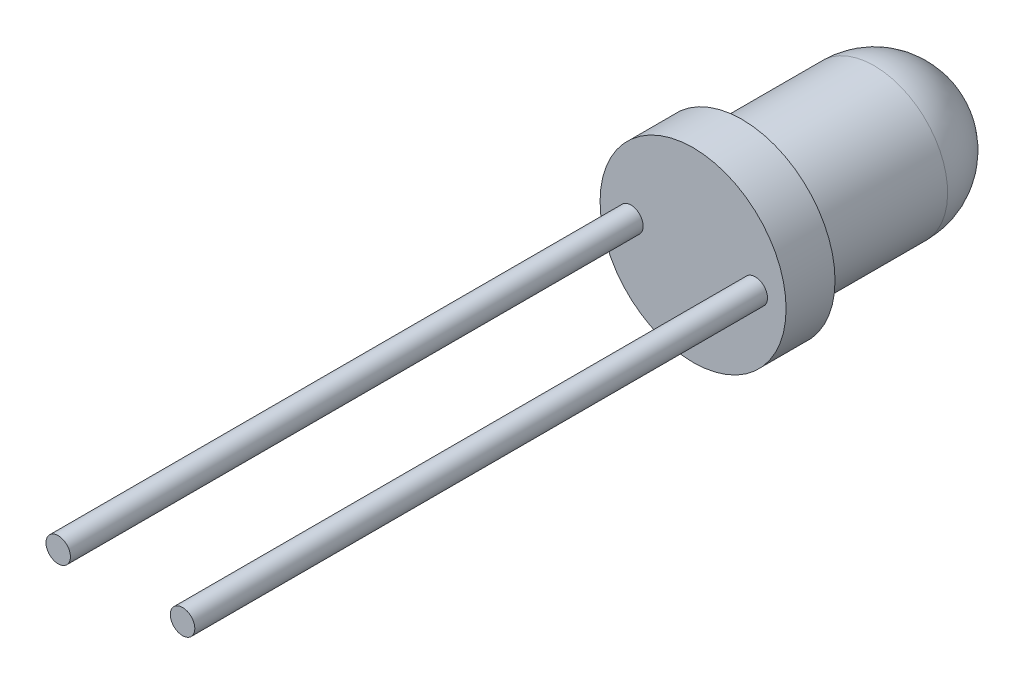
ISO-10303-21;
HEADER;
FILE_DESCRIPTION(('STEP AP214'),'2;1');
FILE_NAME('part.step','',(''),(''),'','','');
FILE_SCHEMA(('AUTOMOTIVE_DESIGN { 1 0 10303 214 1 1 1 1 }'));
ENDSEC;
DATA;
#1=APPLICATION_CONTEXT('core data for automotive mechanical design processes');
#2=APPLICATION_PROTOCOL_DEFINITION('international standard','automotive_design',2000,#1);
#3=PRODUCT_CONTEXT('',#1,'mechanical');
#4=PRODUCT('Part','Part','',(#3));
#5=PRODUCT_RELATED_PRODUCT_CATEGORY('part','',(#4));
#6=PRODUCT_DEFINITION_FORMATION('','',#4);
#7=PRODUCT_DEFINITION_CONTEXT('part definition',#1,'design');
#8=PRODUCT_DEFINITION('design','',#6,#7);
#9=PRODUCT_DEFINITION_SHAPE('','',#8);
#10=(LENGTH_UNIT() NAMED_UNIT(*) SI_UNIT(.MILLI.,.METRE.));
#11=(NAMED_UNIT(*) PLANE_ANGLE_UNIT() SI_UNIT($,.RADIAN.));
#12=(NAMED_UNIT(*) SI_UNIT($,.STERADIAN.) SOLID_ANGLE_UNIT());
#13=UNCERTAINTY_MEASURE_WITH_UNIT(LENGTH_MEASURE(1.E-05),#10,'distance_accuracy_value','');
#14=(GEOMETRIC_REPRESENTATION_CONTEXT(3) GLOBAL_UNCERTAINTY_ASSIGNED_CONTEXT((#13)) GLOBAL_UNIT_ASSIGNED_CONTEXT((#10,
#11,#12)) REPRESENTATION_CONTEXT('',''));
#15=CARTESIAN_POINT('',(0.,0.,0.));
#16=DIRECTION('',(0.,0.,1.));
#17=DIRECTION('',(1.,0.,0.));
#18=AXIS2_PLACEMENT_3D('',#15,#16,#17);
#19=CARTESIAN_POINT('',(0.,0.,3.7));
#20=DIRECTION('',(0.,0.,-1.));
#21=DIRECTION('',(-1.,0.,0.));
#22=AXIS2_PLACEMENT_3D('',#19,#20,#21);
#23=CYLINDRICAL_SURFACE('',#22,1.5);
#24=CARTESIAN_POINT('',(0.,0.,0.));
#25=DIRECTION('',(0.,0.,-1.));
#26=DIRECTION('',(0.,1.,0.));
#27=AXIS2_PLACEMENT_3D('',#24,#25,#26);
#28=CIRCLE('',#27,1.5);
#29=CARTESIAN_POINT('',(0.,1.5,0.));
#30=VERTEX_POINT('',#29);
#31=EDGE_CURVE('E58',#30,#30,#28,.T.);
#32=ORIENTED_EDGE('',*,*,#31,.F.);
#33=EDGE_LOOP('',(#32));
#34=FACE_BOUND('',#33,.T.);
#35=CARTESIAN_POINT('',(0.,0.,2.7));
#36=DIRECTION('',(0.,0.,1.));
#37=DIRECTION('',(1.,0.,0.));
#38=AXIS2_PLACEMENT_3D('',#35,#36,#37);
#39=CIRCLE('',#38,1.5);
#40=CARTESIAN_POINT('',(1.5,0.,2.7));
#41=VERTEX_POINT('',#40);
#42=EDGE_CURVE('E40',#41,#41,#39,.T.);
#43=ORIENTED_EDGE('',*,*,#42,.F.);
#44=EDGE_LOOP('',(#43));
#45=FACE_BOUND('',#44,.T.);
#46=ADVANCED_FACE('F30',(#34,#45),#23,.T.);
#47=CARTESIAN_POINT('',(0.,0.,2.7));
#48=DIRECTION('',(0.,0.,1.));
#49=DIRECTION('',(1.,0.,0.));
#50=AXIS2_PLACEMENT_3D('',#47,#48,#49);
#51=PLANE('',#50);
#52=CARTESIAN_POINT('',(0.,0.,2.7));
#53=DIRECTION('',(0.,0.,1.));
#54=DIRECTION('',(1.,0.,0.));
#55=AXIS2_PLACEMENT_3D('',#52,#53,#54);
#56=CIRCLE('',#55,1.9);
#57=CARTESIAN_POINT('',(1.9,0.,2.7));
#58=VERTEX_POINT('',#57);
#59=EDGE_CURVE('E44',#58,#58,#56,.T.);
#60=ORIENTED_EDGE('',*,*,#59,.F.);
#61=EDGE_LOOP('',(#60));
#62=FACE_BOUND('',#61,.T.);
#63=ORIENTED_EDGE('',*,*,#42,.T.);
#64=EDGE_LOOP('',(#63));
#65=FACE_BOUND('',#64,.T.);
#66=ADVANCED_FACE('F66',(#62,#65),#51,.F.);
#67=CARTESIAN_POINT('',(0.,0.,2.7));
#68=DIRECTION('',(0.,0.,1.));
#69=DIRECTION('',(1.,0.,0.));
#70=AXIS2_PLACEMENT_3D('',#67,#68,#69);
#71=CYLINDRICAL_SURFACE('',#70,1.9);
#72=ORIENTED_EDGE('',*,*,#59,.T.);
#73=EDGE_LOOP('',(#72));
#74=FACE_BOUND('',#73,.T.);
#75=CARTESIAN_POINT('',(0.,0.,3.7));
#76=DIRECTION('',(0.,0.,1.));
#77=DIRECTION('',(1.,0.,0.));
#78=AXIS2_PLACEMENT_3D('',#75,#76,#77);
#79=CIRCLE('',#78,1.9);
#80=CARTESIAN_POINT('',(1.9,0.,3.7));
#81=VERTEX_POINT('',#80);
#82=EDGE_CURVE('E47',#81,#81,#79,.T.);
#83=ORIENTED_EDGE('',*,*,#82,.F.);
#84=EDGE_LOOP('',(#83));
#85=FACE_BOUND('',#84,.T.);
#86=ADVANCED_FACE('F70',(#74,#85),#71,.T.);
#87=CARTESIAN_POINT('',(0.,0.,3.7));
#88=DIRECTION('',(0.,0.,1.));
#89=DIRECTION('',(1.,0.,0.));
#90=AXIS2_PLACEMENT_3D('',#87,#88,#89);
#91=PLANE('',#90);
#92=CARTESIAN_POINT('',(-1.27,0.,3.7));
#93=DIRECTION('',(0.,0.,1.));
#94=DIRECTION('',(1.,0.,0.));
#95=AXIS2_PLACEMENT_3D('',#92,#93,#94);
#96=CIRCLE('',#95,0.25);
#97=CARTESIAN_POINT('',(-1.02,0.,3.7));
#98=VERTEX_POINT('',#97);
#99=EDGE_CURVE('E10',#98,#98,#96,.T.);
#100=ORIENTED_EDGE('',*,*,#99,.F.);
#101=EDGE_LOOP('',(#100));
#102=FACE_BOUND('',#101,.T.);
#103=CARTESIAN_POINT('',(1.27,0.,3.7));
#104=DIRECTION('',(0.,0.,1.));
#105=DIRECTION('',(1.,0.,0.));
#106=AXIS2_PLACEMENT_3D('',#103,#104,#105);
#107=CIRCLE('',#106,0.25);
#108=CARTESIAN_POINT('',(1.52,0.,3.7));
#109=VERTEX_POINT('',#108);
#110=EDGE_CURVE('E36',#109,#109,#107,.T.);
#111=ORIENTED_EDGE('',*,*,#110,.F.);
#112=EDGE_LOOP('',(#111));
#113=FACE_BOUND('',#112,.T.);
#114=ORIENTED_EDGE('',*,*,#82,.T.);
#115=EDGE_LOOP('',(#114));
#116=FACE_BOUND('',#115,.T.);
#117=ADVANCED_FACE('F76',(#102,#113,#116),#91,.T.);
#118=CARTESIAN_POINT('',(1.27,0.,15.4));
#119=DIRECTION('',(0.,0.,-1.));
#120=DIRECTION('',(-1.,0.,0.));
#121=AXIS2_PLACEMENT_3D('',#118,#119,#120);
#122=CYLINDRICAL_SURFACE('',#121,0.25);
#123=ORIENTED_EDGE('',*,*,#110,.T.);
#124=EDGE_LOOP('',(#123));
#125=FACE_BOUND('',#124,.T.);
#126=CARTESIAN_POINT('',(1.27,0.,15.4));
#127=DIRECTION('',(0.,0.,-1.));
#128=DIRECTION('',(-1.,0.,0.));
#129=AXIS2_PLACEMENT_3D('',#126,#127,#128);
#130=CIRCLE('',#129,0.25);
#131=CARTESIAN_POINT('',(1.02,0.,15.4));
#132=VERTEX_POINT('',#131);
#133=EDGE_CURVE('E50',#132,#132,#130,.T.);
#134=ORIENTED_EDGE('',*,*,#133,.T.);
#135=EDGE_LOOP('',(#134));
#136=FACE_BOUND('',#135,.T.);
#137=ADVANCED_FACE('F81',(#125,#136),#122,.T.);
#138=CARTESIAN_POINT('',(1.27,0.,15.4));
#139=DIRECTION('',(0.,0.,-1.));
#140=DIRECTION('',(-1.,0.,0.));
#141=AXIS2_PLACEMENT_3D('',#138,#139,#140);
#142=PLANE('',#141);
#143=ORIENTED_EDGE('',*,*,#133,.F.);
#144=EDGE_LOOP('',(#143));
#145=FACE_BOUND('',#144,.T.);
#146=ADVANCED_FACE('F88',(#145),#142,.F.);
#147=CARTESIAN_POINT('',(-1.27,0.,15.4));
#148=DIRECTION('',(0.,0.,-1.));
#149=DIRECTION('',(-1.,0.,0.));
#150=AXIS2_PLACEMENT_3D('',#147,#148,#149);
#151=CYLINDRICAL_SURFACE('',#150,0.25);
#152=ORIENTED_EDGE('',*,*,#99,.T.);
#153=EDGE_LOOP('',(#152));
#154=FACE_BOUND('',#153,.T.);
#155=CARTESIAN_POINT('',(-1.27,0.,15.4));
#156=DIRECTION('',(0.,0.,-1.));
#157=DIRECTION('',(1.,0.,0.));
#158=AXIS2_PLACEMENT_3D('',#155,#156,#157);
#159=CIRCLE('',#158,0.25);
#160=CARTESIAN_POINT('',(-1.02,0.,15.4));
#161=VERTEX_POINT('',#160);
#162=EDGE_CURVE('E55',#161,#161,#159,.T.);
#163=ORIENTED_EDGE('',*,*,#162,.T.);
#164=EDGE_LOOP('',(#163));
#165=FACE_BOUND('',#164,.T.);
#166=ADVANCED_FACE('F96',(#154,#165),#151,.T.);
#167=CARTESIAN_POINT('',(-1.27,0.,15.4));
#168=DIRECTION('',(0.,0.,1.));
#169=DIRECTION('',(1.,0.,0.));
#170=AXIS2_PLACEMENT_3D('',#167,#168,#169);
#171=PLANE('',#170);
#172=ORIENTED_EDGE('',*,*,#162,.F.);
#173=EDGE_LOOP('',(#172));
#174=FACE_BOUND('',#173,.T.);
#175=ADVANCED_FACE('F103',(#174),#171,.T.);
#176=CARTESIAN_POINT('',(0.,0.,0.));
#177=DIRECTION('',(0.,0.,-1.));
#178=DIRECTION('',(0.,1.,0.));
#179=AXIS2_PLACEMENT_3D('',#176,#177,#178);
#180=SPHERICAL_SURFACE('',#179,1.5);
#181=ORIENTED_EDGE('',*,*,#31,.T.);
#182=EDGE_LOOP('',(#181));
#183=FACE_BOUND('',#182,.T.);
#184=ADVANCED_FACE('F62',(#183),#180,.T.);
#185=CLOSED_SHELL('',(#46,#66,#86,#117,#137,#146,#166,#175,#184));
#186=MANIFOLD_SOLID_BREP('B2',#185);
#187=ADVANCED_BREP_SHAPE_REPRESENTATION('',(#18,#186),#14);
#188=SHAPE_DEFINITION_REPRESENTATION(#9,#187);
ENDSEC;
END-ISO-10303-21;
